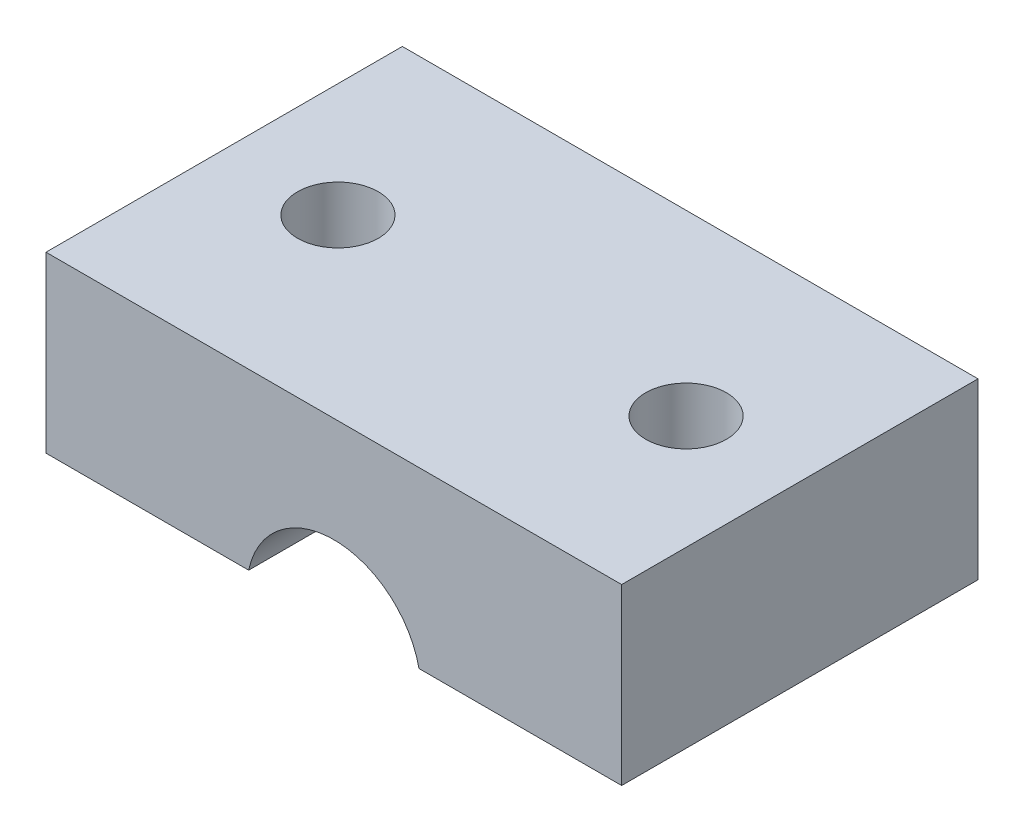
ISO-10303-21;
HEADER;
FILE_DESCRIPTION(('STEP AP214'),'2;1');
FILE_NAME('part.step','',(''),(''),'','','');
FILE_SCHEMA(('AUTOMOTIVE_DESIGN { 1 0 10303 214 1 1 1 1 }'));
ENDSEC;
DATA;
#1=APPLICATION_CONTEXT('core data for automotive mechanical design processes');
#2=APPLICATION_PROTOCOL_DEFINITION('international standard','automotive_design',2000,#1);
#3=PRODUCT_CONTEXT('',#1,'mechanical');
#4=PRODUCT('Part','Part','',(#3));
#5=PRODUCT_RELATED_PRODUCT_CATEGORY('part','',(#4));
#6=PRODUCT_DEFINITION_FORMATION('','',#4);
#7=PRODUCT_DEFINITION_CONTEXT('part definition',#1,'design');
#8=PRODUCT_DEFINITION('design','',#6,#7);
#9=PRODUCT_DEFINITION_SHAPE('','',#8);
#10=(LENGTH_UNIT() NAMED_UNIT(*) SI_UNIT(.MILLI.,.METRE.));
#11=(NAMED_UNIT(*) PLANE_ANGLE_UNIT() SI_UNIT($,.RADIAN.));
#12=(NAMED_UNIT(*) SI_UNIT($,.STERADIAN.) SOLID_ANGLE_UNIT());
#13=UNCERTAINTY_MEASURE_WITH_UNIT(LENGTH_MEASURE(1.E-05),#10,'distance_accuracy_value','');
#14=(GEOMETRIC_REPRESENTATION_CONTEXT(3) GLOBAL_UNCERTAINTY_ASSIGNED_CONTEXT((#13)) GLOBAL_UNIT_ASSIGNED_CONTEXT((#10,
#11,#12)) REPRESENTATION_CONTEXT('',''));
#15=CARTESIAN_POINT('',(0.,0.,0.));
#16=DIRECTION('',(0.,0.,1.));
#17=DIRECTION('',(1.,0.,0.));
#18=AXIS2_PLACEMENT_3D('',#15,#16,#17);
#19=CARTESIAN_POINT('',(0.,0.,0.));
#20=DIRECTION('',(0.,1.,0.));
#21=DIRECTION('',(0.,0.,1.));
#22=AXIS2_PLACEMENT_3D('',#19,#20,#21);
#23=PLANE('',#22);
#24=CARTESIAN_POINT('',(26.85,0.,6.5));
#25=DIRECTION('',(0.,1.,0.));
#26=DIRECTION('',(0.,0.,1.));
#27=AXIS2_PLACEMENT_3D('',#24,#25,#26);
#28=CIRCLE('',#27,1.4732);
#29=CARTESIAN_POINT('',(26.85,0.,7.9732));
#30=VERTEX_POINT('',#29);
#31=EDGE_CURVE('E149',#30,#30,#28,.T.);
#32=ORIENTED_EDGE('',*,*,#31,.T.);
#33=EDGE_LOOP('',(#32));
#34=FACE_BOUND('',#33,.T.);
#35=DIRECTION('',(1.,0.,0.));
#36=VECTOR('',#35,1.);
#37=CARTESIAN_POINT('',(0.,0.,13.));
#38=LINE('',#37,#36);
#39=CARTESIAN_POINT('',(23.60642,0.,13.));
#40=VERTEX_POINT('',#39);
#41=CARTESIAN_POINT('',(31.,0.,13.));
#42=VERTEX_POINT('',#41);
#43=EDGE_CURVE('E111',#40,#42,#38,.T.);
#44=ORIENTED_EDGE('',*,*,#43,.F.);
#45=DIRECTION('',(0.,0.,-1.));
#46=VECTOR('',#45,1.);
#47=CARTESIAN_POINT('',(23.60642,0.,19.7039569149199));
#48=LINE('',#47,#46);
#49=CARTESIAN_POINT('',(23.60642,0.,0.));
#50=VERTEX_POINT('',#49);
#51=EDGE_CURVE('E101',#40,#50,#48,.T.);
#52=ORIENTED_EDGE('',*,*,#51,.T.);
#53=DIRECTION('',(1.,0.,0.));
#54=VECTOR('',#53,1.);
#55=CARTESIAN_POINT('',(0.,0.,0.));
#56=LINE('',#55,#54);
#57=CARTESIAN_POINT('',(31.,0.,0.));
#58=VERTEX_POINT('',#57);
#59=EDGE_CURVE('E81',#50,#58,#56,.T.);
#60=ORIENTED_EDGE('',*,*,#59,.T.);
#61=DIRECTION('',(0.,0.,1.));
#62=VECTOR('',#61,1.);
#63=CARTESIAN_POINT('',(31.,0.,0.));
#64=LINE('',#63,#62);
#65=EDGE_CURVE('E119',#58,#42,#64,.T.);
#66=ORIENTED_EDGE('',*,*,#65,.T.);
#67=EDGE_LOOP('',(#44,#52,#60,#66));
#68=FACE_BOUND('',#67,.T.);
#69=ADVANCED_FACE('F35',(#34,#68),#23,.F.);
#70=CARTESIAN_POINT('',(0.,6.35,0.));
#71=DIRECTION('',(0.,0.,-1.));
#72=DIRECTION('',(-1.,0.,0.));
#73=AXIS2_PLACEMENT_3D('',#70,#71,#72);
#74=PLANE('',#73);
#75=CARTESIAN_POINT('',(20.5,-0.656338162535145,0.));
#76=DIRECTION('',(0.,0.,-1.));
#77=DIRECTION('',(-1.,0.,0.));
#78=AXIS2_PLACEMENT_3D('',#75,#76,#77);
#79=CIRCLE('',#78,3.175);
#80=CARTESIAN_POINT('',(17.39358,0.,0.));
#81=VERTEX_POINT('',#80);
#82=EDGE_CURVE('E97',#81,#50,#79,.T.);
#83=ORIENTED_EDGE('',*,*,#82,.F.);
#84=CARTESIAN_POINT('',(10.,0.,0.));
#85=VERTEX_POINT('',#84);
#86=EDGE_CURVE('E104',#85,#81,#56,.T.);
#87=ORIENTED_EDGE('',*,*,#86,.F.);
#88=DIRECTION('',(0.,-1.,0.));
#89=VECTOR('',#88,1.);
#90=CARTESIAN_POINT('',(10.,6.35,0.));
#91=LINE('',#90,#89);
#92=CARTESIAN_POINT('',(10.,6.35,0.));
#93=VERTEX_POINT('',#92);
#94=EDGE_CURVE('E11',#93,#85,#91,.T.);
#95=ORIENTED_EDGE('',*,*,#94,.F.);
#96=DIRECTION('',(1.,0.,0.));
#97=VECTOR('',#96,1.);
#98=CARTESIAN_POINT('',(0.,6.35,0.));
#99=LINE('',#98,#97);
#100=CARTESIAN_POINT('',(31.,6.35,0.));
#101=VERTEX_POINT('',#100);
#102=EDGE_CURVE('E138',#93,#101,#99,.T.);
#103=ORIENTED_EDGE('',*,*,#102,.T.);
#104=DIRECTION('',(0.,-1.,0.));
#105=VECTOR('',#104,1.);
#106=CARTESIAN_POINT('',(31.,6.35,0.));
#107=LINE('',#106,#105);
#108=EDGE_CURVE('E59',#101,#58,#107,.T.);
#109=ORIENTED_EDGE('',*,*,#108,.T.);
#110=ORIENTED_EDGE('',*,*,#59,.F.);
#111=EDGE_LOOP('',(#83,#87,#95,#103,#109,#110));
#112=FACE_BOUND('',#111,.T.);
#113=ADVANCED_FACE('F103',(#112),#74,.T.);
#114=CARTESIAN_POINT('',(10.,6.35,0.));
#115=DIRECTION('',(1.,0.,0.));
#116=DIRECTION('',(0.,0.,-1.));
#117=AXIS2_PLACEMENT_3D('',#114,#115,#116);
#118=PLANE('',#117);
#119=DIRECTION('',(0.,0.,1.));
#120=VECTOR('',#119,1.);
#121=CARTESIAN_POINT('',(10.,0.,0.));
#122=LINE('',#121,#120);
#123=CARTESIAN_POINT('',(10.,0.,13.));
#124=VERTEX_POINT('',#123);
#125=EDGE_CURVE('E109',#85,#124,#122,.T.);
#126=ORIENTED_EDGE('',*,*,#125,.T.);
#127=DIRECTION('',(0.,-1.,0.));
#128=VECTOR('',#127,1.);
#129=CARTESIAN_POINT('',(10.,6.35,13.));
#130=LINE('',#129,#128);
#131=CARTESIAN_POINT('',(10.,6.35,13.));
#132=VERTEX_POINT('',#131);
#133=EDGE_CURVE('E43',#132,#124,#130,.T.);
#134=ORIENTED_EDGE('',*,*,#133,.F.);
#135=DIRECTION('',(0.,0.,1.));
#136=VECTOR('',#135,1.);
#137=CARTESIAN_POINT('',(10.,6.35,0.));
#138=LINE('',#137,#136);
#139=EDGE_CURVE('E135',#93,#132,#138,.T.);
#140=ORIENTED_EDGE('',*,*,#139,.F.);
#141=ORIENTED_EDGE('',*,*,#94,.T.);
#142=EDGE_LOOP('',(#126,#134,#140,#141));
#143=FACE_BOUND('',#142,.T.);
#144=ADVANCED_FACE('F134',(#143),#118,.F.);
#145=CARTESIAN_POINT('',(0.,6.35,13.));
#146=DIRECTION('',(0.,0.,-1.));
#147=DIRECTION('',(-1.,0.,0.));
#148=AXIS2_PLACEMENT_3D('',#145,#146,#147);
#149=PLANE('',#148);
#150=CARTESIAN_POINT('',(17.39358,0.,13.));
#151=VERTEX_POINT('',#150);
#152=EDGE_CURVE('E117',#124,#151,#38,.T.);
#153=ORIENTED_EDGE('',*,*,#152,.T.);
#154=CARTESIAN_POINT('',(20.5,-0.656338162535145,13.));
#155=DIRECTION('',(0.,0.,-1.));
#156=DIRECTION('',(-1.,0.,0.));
#157=AXIS2_PLACEMENT_3D('',#154,#155,#156);
#158=CIRCLE('',#157,3.175);
#159=EDGE_CURVE('E50',#40,#151,#158,.F.);
#160=ORIENTED_EDGE('',*,*,#159,.F.);
#161=ORIENTED_EDGE('',*,*,#43,.T.);
#162=DIRECTION('',(0.,-1.,0.));
#163=VECTOR('',#162,1.);
#164=CARTESIAN_POINT('',(31.,6.35,13.));
#165=LINE('',#164,#163);
#166=CARTESIAN_POINT('',(31.,6.35,13.));
#167=VERTEX_POINT('',#166);
#168=EDGE_CURVE('E123',#167,#42,#165,.T.);
#169=ORIENTED_EDGE('',*,*,#168,.F.);
#170=DIRECTION('',(1.,0.,0.));
#171=VECTOR('',#170,1.);
#172=CARTESIAN_POINT('',(0.,6.35,13.));
#173=LINE('',#172,#171);
#174=EDGE_CURVE('E131',#132,#167,#173,.T.);
#175=ORIENTED_EDGE('',*,*,#174,.F.);
#176=ORIENTED_EDGE('',*,*,#133,.T.);
#177=EDGE_LOOP('',(#153,#160,#161,#169,#175,#176));
#178=FACE_BOUND('',#177,.T.);
#179=ADVANCED_FACE('F129',(#178),#149,.F.);
#180=CARTESIAN_POINT('',(14.15,6.35,6.5));
#181=DIRECTION('',(0.,-1.,0.));
#182=DIRECTION('',(0.,0.,-1.));
#183=AXIS2_PLACEMENT_3D('',#180,#181,#182);
#184=CYLINDRICAL_SURFACE('',#183,1.4732);
#185=CARTESIAN_POINT('',(14.15,6.35,6.5));
#186=DIRECTION('',(0.,1.,0.));
#187=DIRECTION('',(0.,0.,1.));
#188=AXIS2_PLACEMENT_3D('',#185,#186,#187);
#189=CIRCLE('',#188,1.4732);
#190=CARTESIAN_POINT('',(14.15,6.35,7.9732));
#191=VERTEX_POINT('',#190);
#192=EDGE_CURVE('E142',#191,#191,#189,.T.);
#193=ORIENTED_EDGE('',*,*,#192,.T.);
#194=EDGE_LOOP('',(#193));
#195=FACE_BOUND('',#194,.T.);
#196=CARTESIAN_POINT('',(14.15,0.,6.5));
#197=DIRECTION('',(0.,1.,0.));
#198=DIRECTION('',(0.,0.,1.));
#199=AXIS2_PLACEMENT_3D('',#196,#197,#198);
#200=CIRCLE('',#199,1.4732);
#201=CARTESIAN_POINT('',(14.15,0.,7.9732));
#202=VERTEX_POINT('',#201);
#203=EDGE_CURVE('E113',#202,#202,#200,.T.);
#204=ORIENTED_EDGE('',*,*,#203,.F.);
#205=EDGE_LOOP('',(#204));
#206=FACE_BOUND('',#205,.T.);
#207=ADVANCED_FACE('F167',(#195,#206),#184,.F.);
#208=CARTESIAN_POINT('',(26.85,6.35,6.5));
#209=DIRECTION('',(0.,-1.,0.));
#210=DIRECTION('',(0.,0.,-1.));
#211=AXIS2_PLACEMENT_3D('',#208,#209,#210);
#212=CYLINDRICAL_SURFACE('',#211,1.4732);
#213=CARTESIAN_POINT('',(26.85,6.35,6.5));
#214=DIRECTION('',(0.,1.,0.));
#215=DIRECTION('',(0.,0.,1.));
#216=AXIS2_PLACEMENT_3D('',#213,#214,#215);
#217=CIRCLE('',#216,1.4732);
#218=CARTESIAN_POINT('',(26.85,6.35,7.9732));
#219=VERTEX_POINT('',#218);
#220=EDGE_CURVE('E121',#219,#219,#217,.T.);
#221=ORIENTED_EDGE('',*,*,#220,.T.);
#222=EDGE_LOOP('',(#221));
#223=FACE_BOUND('',#222,.T.);
#224=ORIENTED_EDGE('',*,*,#31,.F.);
#225=EDGE_LOOP('',(#224));
#226=FACE_BOUND('',#225,.T.);
#227=ADVANCED_FACE('F37',(#223,#226),#212,.F.);
#228=CARTESIAN_POINT('',(31.,6.35,0.));
#229=DIRECTION('',(1.,0.,0.));
#230=DIRECTION('',(0.,0.,-1.));
#231=AXIS2_PLACEMENT_3D('',#228,#229,#230);
#232=PLANE('',#231);
#233=ORIENTED_EDGE('',*,*,#65,.F.);
#234=ORIENTED_EDGE('',*,*,#108,.F.);
#235=DIRECTION('',(0.,0.,1.));
#236=VECTOR('',#235,1.);
#237=CARTESIAN_POINT('',(31.,6.35,0.));
#238=LINE('',#237,#236);
#239=EDGE_CURVE('E124',#101,#167,#238,.T.);
#240=ORIENTED_EDGE('',*,*,#239,.T.);
#241=ORIENTED_EDGE('',*,*,#168,.T.);
#242=EDGE_LOOP('',(#233,#234,#240,#241));
#243=FACE_BOUND('',#242,.T.);
#244=ADVANCED_FACE('F163',(#243),#232,.T.);
#245=CARTESIAN_POINT('',(0.,6.35,0.));
#246=DIRECTION('',(0.,1.,0.));
#247=DIRECTION('',(0.,0.,1.));
#248=AXIS2_PLACEMENT_3D('',#245,#246,#247);
#249=PLANE('',#248);
#250=ORIENTED_EDGE('',*,*,#220,.F.);
#251=EDGE_LOOP('',(#250));
#252=FACE_BOUND('',#251,.T.);
#253=ORIENTED_EDGE('',*,*,#192,.F.);
#254=EDGE_LOOP('',(#253));
#255=FACE_BOUND('',#254,.T.);
#256=ORIENTED_EDGE('',*,*,#102,.F.);
#257=ORIENTED_EDGE('',*,*,#139,.T.);
#258=ORIENTED_EDGE('',*,*,#174,.T.);
#259=ORIENTED_EDGE('',*,*,#239,.F.);
#260=EDGE_LOOP('',(#256,#257,#258,#259));
#261=FACE_BOUND('',#260,.T.);
#262=ADVANCED_FACE('F141',(#252,#255,#261),#249,.T.);
#263=ORIENTED_EDGE('',*,*,#203,.T.);
#264=EDGE_LOOP('',(#263));
#265=FACE_BOUND('',#264,.T.);
#266=ORIENTED_EDGE('',*,*,#86,.T.);
#267=DIRECTION('',(0.,0.,-1.));
#268=VECTOR('',#267,1.);
#269=CARTESIAN_POINT('',(17.39358,0.,19.7039569149199));
#270=LINE('',#269,#268);
#271=EDGE_CURVE('E94',#151,#81,#270,.T.);
#272=ORIENTED_EDGE('',*,*,#271,.F.);
#273=ORIENTED_EDGE('',*,*,#152,.F.);
#274=ORIENTED_EDGE('',*,*,#125,.F.);
#275=EDGE_LOOP('',(#266,#272,#273,#274));
#276=FACE_BOUND('',#275,.T.);
#277=ADVANCED_FACE('F107',(#265,#276),#23,.F.);
#278=CARTESIAN_POINT('',(20.5,-0.656338162535145,19.7039569149199));
#279=DIRECTION('',(0.,0.,-1.));
#280=DIRECTION('',(-1.,0.,0.));
#281=AXIS2_PLACEMENT_3D('',#278,#279,#280);
#282=CYLINDRICAL_SURFACE('',#281,3.175);
#283=ORIENTED_EDGE('',*,*,#159,.T.);
#284=ORIENTED_EDGE('',*,*,#271,.T.);
#285=ORIENTED_EDGE('',*,*,#82,.T.);
#286=ORIENTED_EDGE('',*,*,#51,.F.);
#287=EDGE_LOOP('',(#283,#284,#285,#286));
#288=FACE_BOUND('',#287,.T.);
#289=ADVANCED_FACE('F96',(#288),#282,.F.);
#290=CLOSED_SHELL('',(#69,#113,#144,#179,#207,#227,#244,#262,#277,#289));
#291=MANIFOLD_SOLID_BREP('B2',#290);
#292=ADVANCED_BREP_SHAPE_REPRESENTATION('',(#18,#291),#14);
#293=SHAPE_DEFINITION_REPRESENTATION(#9,#292);
ENDSEC;
END-ISO-10303-21;
